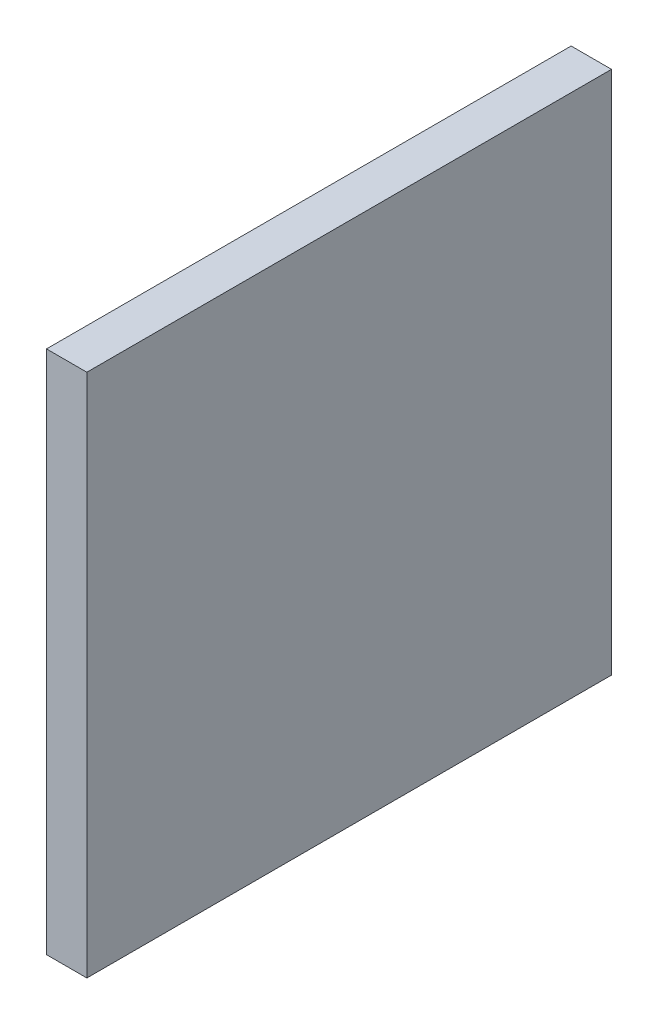
ISO-10303-21;
HEADER;
FILE_DESCRIPTION(('STEP AP214'),'2;1');
FILE_NAME('part.step','',(''),(''),'','','');
FILE_SCHEMA(('AUTOMOTIVE_DESIGN { 1 0 10303 214 1 1 1 1 }'));
ENDSEC;
DATA;
#1=APPLICATION_CONTEXT('core data for automotive mechanical design processes');
#2=APPLICATION_PROTOCOL_DEFINITION('international standard','automotive_design',2000,#1);
#3=PRODUCT_CONTEXT('',#1,'mechanical');
#4=PRODUCT('Part','Part','',(#3));
#5=PRODUCT_RELATED_PRODUCT_CATEGORY('part','',(#4));
#6=PRODUCT_DEFINITION_FORMATION('','',#4);
#7=PRODUCT_DEFINITION_CONTEXT('part definition',#1,'design');
#8=PRODUCT_DEFINITION('design','',#6,#7);
#9=PRODUCT_DEFINITION_SHAPE('','',#8);
#10=(LENGTH_UNIT() NAMED_UNIT(*) SI_UNIT(.MILLI.,.METRE.));
#11=(NAMED_UNIT(*) PLANE_ANGLE_UNIT() SI_UNIT($,.RADIAN.));
#12=(NAMED_UNIT(*) SI_UNIT($,.STERADIAN.) SOLID_ANGLE_UNIT());
#13=UNCERTAINTY_MEASURE_WITH_UNIT(LENGTH_MEASURE(1.E-05),#10,'distance_accuracy_value','');
#14=(GEOMETRIC_REPRESENTATION_CONTEXT(3) GLOBAL_UNCERTAINTY_ASSIGNED_CONTEXT((#13)) GLOBAL_UNIT_ASSIGNED_CONTEXT((#10,
#11,#12)) REPRESENTATION_CONTEXT('',''));
#15=CARTESIAN_POINT('',(0.,0.,0.));
#16=DIRECTION('',(0.,0.,1.));
#17=DIRECTION('',(1.,0.,0.));
#18=AXIS2_PLACEMENT_3D('',#15,#16,#17);
#19=CARTESIAN_POINT('',(12.7,-82.5,82.5));
#20=DIRECTION('',(0.,0.,-1.));
#21=DIRECTION('',(-1.,0.,0.));
#22=AXIS2_PLACEMENT_3D('',#19,#20,#21);
#23=PLANE('',#22);
#24=DIRECTION('',(0.,-1.,0.));
#25=VECTOR('',#24,1.);
#26=CARTESIAN_POINT('',(0.,-82.5,82.5));
#27=LINE('',#26,#25);
#28=CARTESIAN_POINT('',(0.,82.5,82.5));
#29=VERTEX_POINT('',#28);
#30=CARTESIAN_POINT('',(0.,-82.5,82.5));
#31=VERTEX_POINT('',#30);
#32=EDGE_CURVE('E96',#29,#31,#27,.T.);
#33=ORIENTED_EDGE('',*,*,#32,.T.);
#34=DIRECTION('',(-1.,0.,0.));
#35=VECTOR('',#34,1.);
#36=CARTESIAN_POINT('',(12.7,-82.5,82.5));
#37=LINE('',#36,#35);
#38=CARTESIAN_POINT('',(12.7,-82.5,82.5));
#39=VERTEX_POINT('',#38);
#40=EDGE_CURVE('E11',#39,#31,#37,.T.);
#41=ORIENTED_EDGE('',*,*,#40,.F.);
#42=DIRECTION('',(0.,-1.,0.));
#43=VECTOR('',#42,1.);
#44=CARTESIAN_POINT('',(12.7,-82.5,82.5));
#45=LINE('',#44,#43);
#46=CARTESIAN_POINT('',(12.7,82.5,82.5));
#47=VERTEX_POINT('',#46);
#48=EDGE_CURVE('E84',#47,#39,#45,.T.);
#49=ORIENTED_EDGE('',*,*,#48,.F.);
#50=DIRECTION('',(-1.,0.,0.));
#51=VECTOR('',#50,1.);
#52=CARTESIAN_POINT('',(12.7,82.5,82.5));
#53=LINE('',#52,#51);
#54=EDGE_CURVE('E92',#47,#29,#53,.T.);
#55=ORIENTED_EDGE('',*,*,#54,.T.);
#56=EDGE_LOOP('',(#33,#41,#49,#55));
#57=FACE_BOUND('',#56,.T.);
#58=ADVANCED_FACE('F33',(#57),#23,.F.);
#59=CARTESIAN_POINT('',(12.7,-82.5,-82.5));
#60=DIRECTION('',(0.,1.,0.));
#61=DIRECTION('',(0.,0.,1.));
#62=AXIS2_PLACEMENT_3D('',#59,#60,#61);
#63=PLANE('',#62);
#64=DIRECTION('',(0.,0.,-1.));
#65=VECTOR('',#64,1.);
#66=CARTESIAN_POINT('',(0.,-82.5,-82.5));
#67=LINE('',#66,#65);
#68=CARTESIAN_POINT('',(0.,-82.5,-82.5));
#69=VERTEX_POINT('',#68);
#70=EDGE_CURVE('E88',#31,#69,#67,.T.);
#71=ORIENTED_EDGE('',*,*,#70,.T.);
#72=DIRECTION('',(-1.,0.,0.));
#73=VECTOR('',#72,1.);
#74=CARTESIAN_POINT('',(12.7,-82.5,-82.5));
#75=LINE('',#74,#73);
#76=CARTESIAN_POINT('',(12.7,-82.5,-82.5));
#77=VERTEX_POINT('',#76);
#78=EDGE_CURVE('E41',#77,#69,#75,.T.);
#79=ORIENTED_EDGE('',*,*,#78,.F.);
#80=DIRECTION('',(0.,0.,-1.));
#81=VECTOR('',#80,1.);
#82=CARTESIAN_POINT('',(12.7,-82.5,-82.5));
#83=LINE('',#82,#81);
#84=EDGE_CURVE('E79',#39,#77,#83,.T.);
#85=ORIENTED_EDGE('',*,*,#84,.F.);
#86=ORIENTED_EDGE('',*,*,#40,.T.);
#87=EDGE_LOOP('',(#71,#79,#85,#86));
#88=FACE_BOUND('',#87,.T.);
#89=ADVANCED_FACE('F87',(#88),#63,.F.);
#90=CARTESIAN_POINT('',(12.7,-82.5,-82.5));
#91=DIRECTION('',(0.,0.,1.));
#92=DIRECTION('',(1.,0.,0.));
#93=AXIS2_PLACEMENT_3D('',#90,#91,#92);
#94=PLANE('',#93);
#95=DIRECTION('',(0.,1.,0.));
#96=VECTOR('',#95,1.);
#97=CARTESIAN_POINT('',(0.,-82.5,-82.5));
#98=LINE('',#97,#96);
#99=CARTESIAN_POINT('',(0.,82.5,-82.5));
#100=VERTEX_POINT('',#99);
#101=EDGE_CURVE('E66',#69,#100,#98,.T.);
#102=ORIENTED_EDGE('',*,*,#101,.T.);
#103=DIRECTION('',(-1.,0.,0.));
#104=VECTOR('',#103,1.);
#105=CARTESIAN_POINT('',(12.7,82.5,-82.5));
#106=LINE('',#105,#104);
#107=CARTESIAN_POINT('',(12.7,82.5,-82.5));
#108=VERTEX_POINT('',#107);
#109=EDGE_CURVE('E89',#108,#100,#106,.T.);
#110=ORIENTED_EDGE('',*,*,#109,.F.);
#111=DIRECTION('',(0.,1.,0.));
#112=VECTOR('',#111,1.);
#113=CARTESIAN_POINT('',(12.7,-82.5,-82.5));
#114=LINE('',#113,#112);
#115=EDGE_CURVE('E82',#77,#108,#114,.T.);
#116=ORIENTED_EDGE('',*,*,#115,.F.);
#117=ORIENTED_EDGE('',*,*,#78,.T.);
#118=EDGE_LOOP('',(#102,#110,#116,#117));
#119=FACE_BOUND('',#118,.T.);
#120=ADVANCED_FACE('F90',(#119),#94,.F.);
#121=CARTESIAN_POINT('',(12.7,82.5,-82.5));
#122=DIRECTION('',(0.,-1.,0.));
#123=DIRECTION('',(0.,0.,-1.));
#124=AXIS2_PLACEMENT_3D('',#121,#122,#123);
#125=PLANE('',#124);
#126=DIRECTION('',(0.,0.,1.));
#127=VECTOR('',#126,1.);
#128=CARTESIAN_POINT('',(0.,82.5,-82.5));
#129=LINE('',#128,#127);
#130=EDGE_CURVE('E72',#100,#29,#129,.T.);
#131=ORIENTED_EDGE('',*,*,#130,.T.);
#132=ORIENTED_EDGE('',*,*,#54,.F.);
#133=DIRECTION('',(0.,0.,1.));
#134=VECTOR('',#133,1.);
#135=CARTESIAN_POINT('',(12.7,82.5,-82.5));
#136=LINE('',#135,#134);
#137=EDGE_CURVE('E49',#108,#47,#136,.T.);
#138=ORIENTED_EDGE('',*,*,#137,.F.);
#139=ORIENTED_EDGE('',*,*,#109,.T.);
#140=EDGE_LOOP('',(#131,#132,#138,#139));
#141=FACE_BOUND('',#140,.T.);
#142=ADVANCED_FACE('F103',(#141),#125,.F.);
#143=CARTESIAN_POINT('',(12.7,0.,0.));
#144=DIRECTION('',(1.,0.,0.));
#145=DIRECTION('',(0.,0.,-1.));
#146=AXIS2_PLACEMENT_3D('',#143,#144,#145);
#147=PLANE('',#146);
#148=ORIENTED_EDGE('',*,*,#48,.T.);
#149=ORIENTED_EDGE('',*,*,#84,.T.);
#150=ORIENTED_EDGE('',*,*,#115,.T.);
#151=ORIENTED_EDGE('',*,*,#137,.T.);
#152=EDGE_LOOP('',(#148,#149,#150,#151));
#153=FACE_BOUND('',#152,.T.);
#154=ADVANCED_FACE('F80',(#153),#147,.T.);
#155=CARTESIAN_POINT('',(0.,0.,0.));
#156=DIRECTION('',(1.,0.,0.));
#157=DIRECTION('',(0.,0.,-1.));
#158=AXIS2_PLACEMENT_3D('',#155,#156,#157);
#159=PLANE('',#158);
#160=ORIENTED_EDGE('',*,*,#32,.F.);
#161=ORIENTED_EDGE('',*,*,#130,.F.);
#162=ORIENTED_EDGE('',*,*,#101,.F.);
#163=ORIENTED_EDGE('',*,*,#70,.F.);
#164=EDGE_LOOP('',(#160,#161,#162,#163));
#165=FACE_BOUND('',#164,.T.);
#166=ADVANCED_FACE('F106',(#165),#159,.F.);
#167=CLOSED_SHELL('',(#58,#89,#120,#142,#154,#166));
#168=MANIFOLD_SOLID_BREP('B2',#167);
#169=ADVANCED_BREP_SHAPE_REPRESENTATION('',(#18,#168),#14);
#170=SHAPE_DEFINITION_REPRESENTATION(#9,#169);
ENDSEC;
END-ISO-10303-21;
